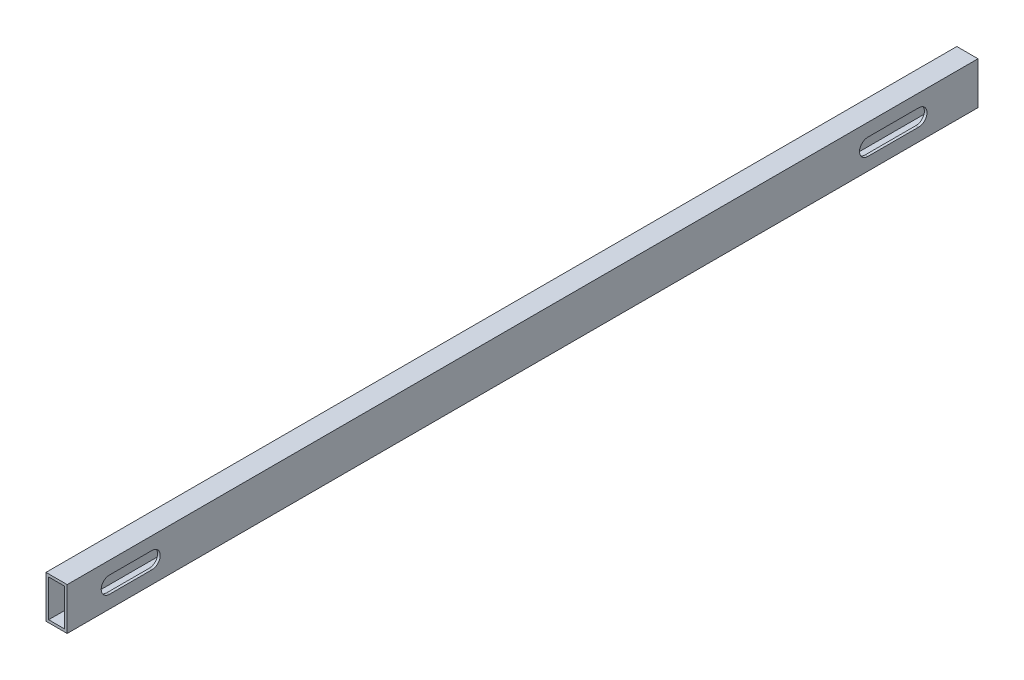
ISO-10303-21;
HEADER;
FILE_DESCRIPTION(('STEP AP214'),'2;1');
FILE_NAME('part.step','',(''),(''),'','','');
FILE_SCHEMA(('AUTOMOTIVE_DESIGN { 1 0 10303 214 1 1 1 1 }'));
ENDSEC;
DATA;
#1=APPLICATION_CONTEXT('core data for automotive mechanical design processes');
#2=APPLICATION_PROTOCOL_DEFINITION('international standard','automotive_design',2000,#1);
#3=PRODUCT_CONTEXT('',#1,'mechanical');
#4=PRODUCT('Part','Part','',(#3));
#5=PRODUCT_RELATED_PRODUCT_CATEGORY('part','',(#4));
#6=PRODUCT_DEFINITION_FORMATION('','',#4);
#7=PRODUCT_DEFINITION_CONTEXT('part definition',#1,'design');
#8=PRODUCT_DEFINITION('design','',#6,#7);
#9=PRODUCT_DEFINITION_SHAPE('','',#8);
#10=(LENGTH_UNIT() NAMED_UNIT(*) SI_UNIT(.MILLI.,.METRE.));
#11=(NAMED_UNIT(*) PLANE_ANGLE_UNIT() SI_UNIT($,.RADIAN.));
#12=(NAMED_UNIT(*) SI_UNIT($,.STERADIAN.) SOLID_ANGLE_UNIT());
#13=UNCERTAINTY_MEASURE_WITH_UNIT(LENGTH_MEASURE(1.E-05),#10,'distance_accuracy_value','');
#14=(GEOMETRIC_REPRESENTATION_CONTEXT(3) GLOBAL_UNCERTAINTY_ASSIGNED_CONTEXT((#13)) GLOBAL_UNIT_ASSIGNED_CONTEXT((#10,
#11,#12)) REPRESENTATION_CONTEXT('',''));
#15=CARTESIAN_POINT('',(0.,0.,0.));
#16=DIRECTION('',(0.,0.,1.));
#17=DIRECTION('',(1.,0.,0.));
#18=AXIS2_PLACEMENT_3D('',#15,#16,#17);
#19=CARTESIAN_POINT('',(6.35,-12.7,546.1));
#20=DIRECTION('',(-1.,0.,0.));
#21=DIRECTION('',(0.,0.,1.));
#22=AXIS2_PLACEMENT_3D('',#19,#20,#21);
#23=PLANE('',#22);
#24=DIRECTION('',(0.,0.,-1.));
#25=VECTOR('',#24,1.);
#26=CARTESIAN_POINT('',(6.35,5.,495.3));
#27=LINE('',#26,#25);
#28=CARTESIAN_POINT('',(6.35,5.,520.7));
#29=VERTEX_POINT('',#28);
#30=CARTESIAN_POINT('',(6.35,5.,495.3));
#31=VERTEX_POINT('',#30);
#32=EDGE_CURVE('E221',#29,#31,#27,.T.);
#33=ORIENTED_EDGE('',*,*,#32,.T.);
#34=CARTESIAN_POINT('',(6.35,0.,495.3));
#35=DIRECTION('',(-1.,0.,0.));
#36=DIRECTION('',(0.,0.,1.));
#37=AXIS2_PLACEMENT_3D('',#34,#35,#36);
#38=CIRCLE('',#37,5.);
#39=CARTESIAN_POINT('',(6.35,-5.,495.3));
#40=VERTEX_POINT('',#39);
#41=EDGE_CURVE('E214',#31,#40,#38,.T.);
#42=ORIENTED_EDGE('',*,*,#41,.T.);
#43=DIRECTION('',(0.,0.,1.));
#44=VECTOR('',#43,1.);
#45=CARTESIAN_POINT('',(6.35,-5.,495.3));
#46=LINE('',#45,#44);
#47=CARTESIAN_POINT('',(6.35,-5.,520.7));
#48=VERTEX_POINT('',#47);
#49=EDGE_CURVE('E57',#40,#48,#46,.T.);
#50=ORIENTED_EDGE('',*,*,#49,.T.);
#51=CARTESIAN_POINT('',(6.35,0.,520.7));
#52=DIRECTION('',(-1.,0.,0.));
#53=DIRECTION('',(0.,0.,1.));
#54=AXIS2_PLACEMENT_3D('',#51,#52,#53);
#55=CIRCLE('',#54,5.);
#56=EDGE_CURVE('E218',#48,#29,#55,.T.);
#57=ORIENTED_EDGE('',*,*,#56,.T.);
#58=EDGE_LOOP('',(#33,#42,#50,#57));
#59=FACE_BOUND('',#58,.T.);
#60=DIRECTION('',(0.,1.,0.));
#61=VECTOR('',#60,1.);
#62=CARTESIAN_POINT('',(6.35,-12.7,0.));
#63=LINE('',#62,#61);
#64=CARTESIAN_POINT('',(6.35,-12.7,0.));
#65=VERTEX_POINT('',#64);
#66=CARTESIAN_POINT('',(6.35,12.7,0.));
#67=VERTEX_POINT('',#66);
#68=EDGE_CURVE('E299',#65,#67,#63,.T.);
#69=ORIENTED_EDGE('',*,*,#68,.T.);
#70=DIRECTION('',(0.,0.,-1.));
#71=VECTOR('',#70,1.);
#72=CARTESIAN_POINT('',(6.35,12.7,546.1));
#73=LINE('',#72,#71);
#74=CARTESIAN_POINT('',(6.35,12.7,546.1));
#75=VERTEX_POINT('',#74);
#76=EDGE_CURVE('E326',#75,#67,#73,.T.);
#77=ORIENTED_EDGE('',*,*,#76,.F.);
#78=DIRECTION('',(0.,1.,0.));
#79=VECTOR('',#78,1.);
#80=CARTESIAN_POINT('',(6.35,-12.7,546.1));
#81=LINE('',#80,#79);
#82=CARTESIAN_POINT('',(6.35,-12.7,546.1));
#83=VERTEX_POINT('',#82);
#84=EDGE_CURVE('E300',#83,#75,#81,.T.);
#85=ORIENTED_EDGE('',*,*,#84,.F.);
#86=DIRECTION('',(0.,0.,-1.));
#87=VECTOR('',#86,1.);
#88=CARTESIAN_POINT('',(6.35,-12.7,546.1));
#89=LINE('',#88,#87);
#90=EDGE_CURVE('E310',#83,#65,#89,.T.);
#91=ORIENTED_EDGE('',*,*,#90,.T.);
#92=EDGE_LOOP('',(#69,#77,#85,#91));
#93=FACE_BOUND('',#92,.T.);
#94=DIRECTION('',(0.,0.,-1.));
#95=VECTOR('',#94,1.);
#96=CARTESIAN_POINT('',(6.35,5.,35.56));
#97=LINE('',#96,#95);
#98=CARTESIAN_POINT('',(6.35,5.,66.04));
#99=VERTEX_POINT('',#98);
#100=CARTESIAN_POINT('',(6.35,5.,35.56));
#101=VERTEX_POINT('',#100);
#102=EDGE_CURVE('E186',#99,#101,#97,.T.);
#103=ORIENTED_EDGE('',*,*,#102,.T.);
#104=CARTESIAN_POINT('',(6.35,0.,35.56));
#105=DIRECTION('',(-1.,0.,0.));
#106=DIRECTION('',(0.,0.,1.));
#107=AXIS2_PLACEMENT_3D('',#104,#105,#106);
#108=CIRCLE('',#107,5.);
#109=CARTESIAN_POINT('',(6.35,-5.,35.56));
#110=VERTEX_POINT('',#109);
#111=EDGE_CURVE('E190',#101,#110,#108,.T.);
#112=ORIENTED_EDGE('',*,*,#111,.T.);
#113=DIRECTION('',(0.,0.,1.));
#114=VECTOR('',#113,1.);
#115=CARTESIAN_POINT('',(6.35,-5.,35.56));
#116=LINE('',#115,#114);
#117=CARTESIAN_POINT('',(6.35,-5.,66.04));
#118=VERTEX_POINT('',#117);
#119=EDGE_CURVE('E49',#110,#118,#116,.T.);
#120=ORIENTED_EDGE('',*,*,#119,.T.);
#121=CARTESIAN_POINT('',(6.35,0.,66.04));
#122=DIRECTION('',(-1.,0.,0.));
#123=DIRECTION('',(0.,0.,1.));
#124=AXIS2_PLACEMENT_3D('',#121,#122,#123);
#125=CIRCLE('',#124,5.);
#126=EDGE_CURVE('E181',#118,#99,#125,.T.);
#127=ORIENTED_EDGE('',*,*,#126,.T.);
#128=EDGE_LOOP('',(#103,#112,#120,#127));
#129=FACE_BOUND('',#128,.T.);
#130=ADVANCED_FACE('F35',(#59,#93,#129),#23,.F.);
#131=CARTESIAN_POINT('',(4.7625,-11.1125,546.1));
#132=DIRECTION('',(-1.,0.,0.));
#133=DIRECTION('',(0.,0.,1.));
#134=AXIS2_PLACEMENT_3D('',#131,#132,#133);
#135=PLANE('',#134);
#136=CARTESIAN_POINT('',(4.7625,0.,495.3));
#137=DIRECTION('',(-1.,0.,0.));
#138=DIRECTION('',(0.,0.,1.));
#139=AXIS2_PLACEMENT_3D('',#136,#137,#138);
#140=CIRCLE('',#139,5.);
#141=CARTESIAN_POINT('',(4.7625,5.,495.3));
#142=VERTEX_POINT('',#141);
#143=CARTESIAN_POINT('',(4.7625,-5.,495.3));
#144=VERTEX_POINT('',#143);
#145=EDGE_CURVE('E211',#142,#144,#140,.T.);
#146=ORIENTED_EDGE('',*,*,#145,.F.);
#147=DIRECTION('',(0.,0.,-1.));
#148=VECTOR('',#147,1.);
#149=CARTESIAN_POINT('',(4.7625,5.,495.3));
#150=LINE('',#149,#148);
#151=CARTESIAN_POINT('',(4.7625,5.,520.7));
#152=VERTEX_POINT('',#151);
#153=EDGE_CURVE('E232',#152,#142,#150,.T.);
#154=ORIENTED_EDGE('',*,*,#153,.F.);
#155=CARTESIAN_POINT('',(4.7625,0.,520.7));
#156=DIRECTION('',(-1.,0.,0.));
#157=DIRECTION('',(0.,0.,1.));
#158=AXIS2_PLACEMENT_3D('',#155,#156,#157);
#159=CIRCLE('',#158,5.);
#160=CARTESIAN_POINT('',(4.7625,-5.,520.7));
#161=VERTEX_POINT('',#160);
#162=EDGE_CURVE('E204',#161,#152,#159,.T.);
#163=ORIENTED_EDGE('',*,*,#162,.F.);
#164=DIRECTION('',(0.,0.,1.));
#165=VECTOR('',#164,1.);
#166=CARTESIAN_POINT('',(4.7625,-5.,495.3));
#167=LINE('',#166,#165);
#168=EDGE_CURVE('E207',#144,#161,#167,.T.);
#169=ORIENTED_EDGE('',*,*,#168,.F.);
#170=EDGE_LOOP('',(#146,#154,#163,#169));
#171=FACE_BOUND('',#170,.T.);
#172=DIRECTION('',(0.,1.,0.));
#173=VECTOR('',#172,1.);
#174=CARTESIAN_POINT('',(4.7625,-11.1125,0.));
#175=LINE('',#174,#173);
#176=CARTESIAN_POINT('',(4.7625,-11.1125,0.));
#177=VERTEX_POINT('',#176);
#178=CARTESIAN_POINT('',(4.7625,11.1125,0.));
#179=VERTEX_POINT('',#178);
#180=EDGE_CURVE('E278',#177,#179,#175,.T.);
#181=ORIENTED_EDGE('',*,*,#180,.F.);
#182=DIRECTION('',(0.,0.,-1.));
#183=VECTOR('',#182,1.);
#184=CARTESIAN_POINT('',(4.7625,-11.1125,546.1));
#185=LINE('',#184,#183);
#186=CARTESIAN_POINT('',(4.7625,-11.1125,546.1));
#187=VERTEX_POINT('',#186);
#188=EDGE_CURVE('E277',#187,#177,#185,.T.);
#189=ORIENTED_EDGE('',*,*,#188,.F.);
#190=DIRECTION('',(0.,1.,0.));
#191=VECTOR('',#190,1.);
#192=CARTESIAN_POINT('',(4.7625,-11.1125,546.1));
#193=LINE('',#192,#191);
#194=CARTESIAN_POINT('',(4.7625,11.1125,546.1));
#195=VERTEX_POINT('',#194);
#196=EDGE_CURVE('E267',#187,#195,#193,.T.);
#197=ORIENTED_EDGE('',*,*,#196,.T.);
#198=DIRECTION('',(0.,0.,-1.));
#199=VECTOR('',#198,1.);
#200=CARTESIAN_POINT('',(4.7625,11.1125,546.1));
#201=LINE('',#200,#199);
#202=EDGE_CURVE('E296',#195,#179,#201,.T.);
#203=ORIENTED_EDGE('',*,*,#202,.T.);
#204=EDGE_LOOP('',(#181,#189,#197,#203));
#205=FACE_BOUND('',#204,.T.);
#206=CARTESIAN_POINT('',(4.7625,0.,35.56));
#207=DIRECTION('',(-1.,0.,0.));
#208=DIRECTION('',(0.,0.,1.));
#209=AXIS2_PLACEMENT_3D('',#206,#207,#208);
#210=CIRCLE('',#209,5.);
#211=CARTESIAN_POINT('',(4.7625,5.00000000000001,35.56));
#212=VERTEX_POINT('',#211);
#213=CARTESIAN_POINT('',(4.7625,-5.,35.56));
#214=VERTEX_POINT('',#213);
#215=EDGE_CURVE('E192',#212,#214,#210,.T.);
#216=ORIENTED_EDGE('',*,*,#215,.F.);
#217=DIRECTION('',(0.,0.,-1.));
#218=VECTOR('',#217,1.);
#219=CARTESIAN_POINT('',(4.7625,5.,35.56));
#220=LINE('',#219,#218);
#221=CARTESIAN_POINT('',(4.7625,5.,66.04));
#222=VERTEX_POINT('',#221);
#223=EDGE_CURVE('E201',#222,#212,#220,.T.);
#224=ORIENTED_EDGE('',*,*,#223,.F.);
#225=CARTESIAN_POINT('',(4.7625,0.,66.04));
#226=DIRECTION('',(-1.,0.,0.));
#227=DIRECTION('',(0.,0.,1.));
#228=AXIS2_PLACEMENT_3D('',#225,#226,#227);
#229=CIRCLE('',#228,5.);
#230=CARTESIAN_POINT('',(4.7625,-5.,66.04));
#231=VERTEX_POINT('',#230);
#232=EDGE_CURVE('E234',#231,#222,#229,.T.);
#233=ORIENTED_EDGE('',*,*,#232,.F.);
#234=DIRECTION('',(0.,0.,1.));
#235=VECTOR('',#234,1.);
#236=CARTESIAN_POINT('',(4.7625,-5.,35.56));
#237=LINE('',#236,#235);
#238=EDGE_CURVE('E173',#214,#231,#237,.T.);
#239=ORIENTED_EDGE('',*,*,#238,.F.);
#240=EDGE_LOOP('',(#216,#224,#233,#239));
#241=FACE_BOUND('',#240,.T.);
#242=ADVANCED_FACE('F396',(#171,#205,#241),#135,.T.);
#243=CARTESIAN_POINT('',(0.,0.,546.1));
#244=DIRECTION('',(0.,0.,-1.));
#245=DIRECTION('',(-1.,0.,0.));
#246=AXIS2_PLACEMENT_3D('',#243,#244,#245);
#247=PLANE('',#246);
#248=ORIENTED_EDGE('',*,*,#84,.T.);
#249=DIRECTION('',(-1.,0.,0.));
#250=VECTOR('',#249,1.);
#251=CARTESIAN_POINT('',(-6.35,12.7,546.1));
#252=LINE('',#251,#250);
#253=CARTESIAN_POINT('',(-6.35,12.7,546.1));
#254=VERTEX_POINT('',#253);
#255=EDGE_CURVE('E303',#75,#254,#252,.T.);
#256=ORIENTED_EDGE('',*,*,#255,.T.);
#257=DIRECTION('',(0.,-1.,0.));
#258=VECTOR('',#257,1.);
#259=CARTESIAN_POINT('',(-6.35,-12.7,546.1));
#260=LINE('',#259,#258);
#261=CARTESIAN_POINT('',(-6.35,-12.7,546.1));
#262=VERTEX_POINT('',#261);
#263=EDGE_CURVE('E306',#254,#262,#260,.T.);
#264=ORIENTED_EDGE('',*,*,#263,.T.);
#265=DIRECTION('',(1.,0.,0.));
#266=VECTOR('',#265,1.);
#267=CARTESIAN_POINT('',(-6.35,-12.7,546.1));
#268=LINE('',#267,#266);
#269=EDGE_CURVE('E308',#262,#83,#268,.T.);
#270=ORIENTED_EDGE('',*,*,#269,.T.);
#271=EDGE_LOOP('',(#248,#256,#264,#270));
#272=FACE_BOUND('',#271,.T.);
#273=ORIENTED_EDGE('',*,*,#196,.F.);
#274=DIRECTION('',(1.,0.,0.));
#275=VECTOR('',#274,1.);
#276=CARTESIAN_POINT('',(-4.7625,-11.1125,546.1));
#277=LINE('',#276,#275);
#278=CARTESIAN_POINT('',(-4.7625,-11.1125,546.1));
#279=VERTEX_POINT('',#278);
#280=EDGE_CURVE('E275',#279,#187,#277,.T.);
#281=ORIENTED_EDGE('',*,*,#280,.F.);
#282=DIRECTION('',(0.,-1.,0.));
#283=VECTOR('',#282,1.);
#284=CARTESIAN_POINT('',(-4.7625,-11.1125,546.1));
#285=LINE('',#284,#283);
#286=CARTESIAN_POINT('',(-4.7625,11.1125,546.1));
#287=VERTEX_POINT('',#286);
#288=EDGE_CURVE('E272',#287,#279,#285,.T.);
#289=ORIENTED_EDGE('',*,*,#288,.F.);
#290=DIRECTION('',(-1.,0.,0.));
#291=VECTOR('',#290,1.);
#292=CARTESIAN_POINT('',(-4.7625,11.1125,546.1));
#293=LINE('',#292,#291);
#294=EDGE_CURVE('E269',#195,#287,#293,.T.);
#295=ORIENTED_EDGE('',*,*,#294,.F.);
#296=EDGE_LOOP('',(#273,#281,#289,#295));
#297=FACE_BOUND('',#296,.T.);
#298=ADVANCED_FACE('F387',(#272,#297),#247,.F.);
#299=CARTESIAN_POINT('',(0.,0.,0.));
#300=DIRECTION('',(0.,0.,-1.));
#301=DIRECTION('',(-1.,0.,0.));
#302=AXIS2_PLACEMENT_3D('',#299,#300,#301);
#303=PLANE('',#302);
#304=ORIENTED_EDGE('',*,*,#68,.F.);
#305=DIRECTION('',(1.,0.,0.));
#306=VECTOR('',#305,1.);
#307=CARTESIAN_POINT('',(-6.35,-12.7,0.));
#308=LINE('',#307,#306);
#309=CARTESIAN_POINT('',(-6.35,-12.7,0.));
#310=VERTEX_POINT('',#309);
#311=EDGE_CURVE('E304',#310,#65,#308,.T.);
#312=ORIENTED_EDGE('',*,*,#311,.F.);
#313=DIRECTION('',(0.,-1.,0.));
#314=VECTOR('',#313,1.);
#315=CARTESIAN_POINT('',(-6.35,-12.7,0.));
#316=LINE('',#315,#314);
#317=CARTESIAN_POINT('',(-6.35,12.7,0.));
#318=VERTEX_POINT('',#317);
#319=EDGE_CURVE('E315',#318,#310,#316,.T.);
#320=ORIENTED_EDGE('',*,*,#319,.F.);
#321=DIRECTION('',(-1.,0.,0.));
#322=VECTOR('',#321,1.);
#323=CARTESIAN_POINT('',(-6.35,12.7,0.));
#324=LINE('',#323,#322);
#325=EDGE_CURVE('E313',#67,#318,#324,.T.);
#326=ORIENTED_EDGE('',*,*,#325,.F.);
#327=EDGE_LOOP('',(#304,#312,#320,#326));
#328=FACE_BOUND('',#327,.T.);
#329=DIRECTION('',(1.,0.,0.));
#330=VECTOR('',#329,1.);
#331=CARTESIAN_POINT('',(-4.7625,-11.1125,0.));
#332=LINE('',#331,#330);
#333=CARTESIAN_POINT('',(-4.7625,-11.1125,0.));
#334=VERTEX_POINT('',#333);
#335=EDGE_CURVE('E270',#334,#177,#332,.T.);
#336=ORIENTED_EDGE('',*,*,#335,.T.);
#337=ORIENTED_EDGE('',*,*,#180,.T.);
#338=DIRECTION('',(-1.,0.,0.));
#339=VECTOR('',#338,1.);
#340=CARTESIAN_POINT('',(-4.7625,11.1125,0.));
#341=LINE('',#340,#339);
#342=CARTESIAN_POINT('',(-4.7625,11.1125,0.));
#343=VERTEX_POINT('',#342);
#344=EDGE_CURVE('E281',#179,#343,#341,.T.);
#345=ORIENTED_EDGE('',*,*,#344,.T.);
#346=DIRECTION('',(0.,-1.,0.));
#347=VECTOR('',#346,1.);
#348=CARTESIAN_POINT('',(-4.7625,-11.1125,0.));
#349=LINE('',#348,#347);
#350=EDGE_CURVE('E285',#343,#334,#349,.T.);
#351=ORIENTED_EDGE('',*,*,#350,.T.);
#352=EDGE_LOOP('',(#336,#337,#345,#351));
#353=FACE_BOUND('',#352,.T.);
#354=ADVANCED_FACE('F381',(#328,#353),#303,.T.);
#355=CARTESIAN_POINT('',(-6.35,12.7,546.1));
#356=DIRECTION('',(0.,-1.,0.));
#357=DIRECTION('',(0.,0.,-1.));
#358=AXIS2_PLACEMENT_3D('',#355,#356,#357);
#359=PLANE('',#358);
#360=ORIENTED_EDGE('',*,*,#325,.T.);
#361=DIRECTION('',(0.,0.,-1.));
#362=VECTOR('',#361,1.);
#363=CARTESIAN_POINT('',(-6.35,12.7,546.1));
#364=LINE('',#363,#362);
#365=EDGE_CURVE('E323',#254,#318,#364,.T.);
#366=ORIENTED_EDGE('',*,*,#365,.F.);
#367=ORIENTED_EDGE('',*,*,#255,.F.);
#368=ORIENTED_EDGE('',*,*,#76,.T.);
#369=EDGE_LOOP('',(#360,#366,#367,#368));
#370=FACE_BOUND('',#369,.T.);
#371=ADVANCED_FACE('F363',(#370),#359,.F.);
#372=CARTESIAN_POINT('',(-6.35,-12.7,546.1));
#373=DIRECTION('',(1.,0.,0.));
#374=DIRECTION('',(0.,0.,-1.));
#375=AXIS2_PLACEMENT_3D('',#372,#373,#374);
#376=PLANE('',#375);
#377=DIRECTION('',(0.,0.,-1.));
#378=VECTOR('',#377,1.);
#379=CARTESIAN_POINT('',(-6.35,-3.30199999999994,44.45));
#380=LINE('',#379,#378);
#381=CARTESIAN_POINT('',(-6.35,-3.30199999999992,57.15));
#382=VERTEX_POINT('',#381);
#383=CARTESIAN_POINT('',(-6.35,-3.30199999999994,44.45));
#384=VERTEX_POINT('',#383);
#385=EDGE_CURVE('E247',#382,#384,#380,.T.);
#386=ORIENTED_EDGE('',*,*,#385,.T.);
#387=CARTESIAN_POINT('',(-6.35,0.,44.45));
#388=DIRECTION('',(1.,0.,0.));
#389=DIRECTION('',(0.,0.,-1.));
#390=AXIS2_PLACEMENT_3D('',#387,#388,#389);
#391=CIRCLE('',#390,3.302);
#392=CARTESIAN_POINT('',(-6.35,3.30200000000006,44.45));
#393=VERTEX_POINT('',#392);
#394=EDGE_CURVE('E238',#384,#393,#391,.T.);
#395=ORIENTED_EDGE('',*,*,#394,.T.);
#396=DIRECTION('',(0.,0.,1.));
#397=VECTOR('',#396,1.);
#398=CARTESIAN_POINT('',(-6.35,3.30200000000006,44.45));
#399=LINE('',#398,#397);
#400=CARTESIAN_POINT('',(-6.35,3.30200000000008,57.15));
#401=VERTEX_POINT('',#400);
#402=EDGE_CURVE('E241',#393,#401,#399,.T.);
#403=ORIENTED_EDGE('',*,*,#402,.T.);
#404=CARTESIAN_POINT('',(-6.35,0.,57.15));
#405=DIRECTION('',(1.,0.,0.));
#406=DIRECTION('',(0.,0.,-1.));
#407=AXIS2_PLACEMENT_3D('',#404,#405,#406);
#408=CIRCLE('',#407,3.302);
#409=EDGE_CURVE('E244',#401,#382,#408,.T.);
#410=ORIENTED_EDGE('',*,*,#409,.T.);
#411=EDGE_LOOP('',(#386,#395,#403,#410));
#412=FACE_BOUND('',#411,.T.);
#413=CARTESIAN_POINT('',(-6.35,0.,520.7));
#414=DIRECTION('',(1.,0.,0.));
#415=DIRECTION('',(0.,0.,-1.));
#416=AXIS2_PLACEMENT_3D('',#413,#414,#415);
#417=CIRCLE('',#416,2.75000000000004);
#418=CARTESIAN_POINT('',(-6.35,0.,517.95));
#419=VERTEX_POINT('',#418);
#420=EDGE_CURVE('E237',#419,#419,#417,.T.);
#421=ORIENTED_EDGE('',*,*,#420,.T.);
#422=EDGE_LOOP('',(#421));
#423=FACE_BOUND('',#422,.T.);
#424=CARTESIAN_POINT('',(-6.35,0.,495.3));
#425=DIRECTION('',(1.,0.,0.));
#426=DIRECTION('',(0.,0.,1.));
#427=AXIS2_PLACEMENT_3D('',#424,#425,#426);
#428=CIRCLE('',#427,2.75000000000004);
#429=CARTESIAN_POINT('',(-6.35,0.,498.05));
#430=VERTEX_POINT('',#429);
#431=EDGE_CURVE('E203',#430,#430,#428,.T.);
#432=ORIENTED_EDGE('',*,*,#431,.T.);
#433=EDGE_LOOP('',(#432));
#434=FACE_BOUND('',#433,.T.);
#435=CARTESIAN_POINT('',(-6.35,0.,508.));
#436=DIRECTION('',(1.,0.,0.));
#437=DIRECTION('',(0.,0.,-1.));
#438=AXIS2_PLACEMENT_3D('',#435,#436,#437);
#439=CIRCLE('',#438,3.80999999999999);
#440=CARTESIAN_POINT('',(-6.35,0.,504.19));
#441=VERTEX_POINT('',#440);
#442=EDGE_CURVE('E254',#441,#441,#439,.T.);
#443=ORIENTED_EDGE('',*,*,#442,.T.);
#444=EDGE_LOOP('',(#443));
#445=FACE_BOUND('',#444,.T.);
#446=ORIENTED_EDGE('',*,*,#319,.T.);
#447=DIRECTION('',(0.,0.,-1.));
#448=VECTOR('',#447,1.);
#449=CARTESIAN_POINT('',(-6.35,-12.7,546.1));
#450=LINE('',#449,#448);
#451=EDGE_CURVE('E320',#262,#310,#450,.T.);
#452=ORIENTED_EDGE('',*,*,#451,.F.);
#453=ORIENTED_EDGE('',*,*,#263,.F.);
#454=ORIENTED_EDGE('',*,*,#365,.T.);
#455=EDGE_LOOP('',(#446,#452,#453,#454));
#456=FACE_BOUND('',#455,.T.);
#457=ADVANCED_FACE('F359',(#412,#423,#434,#445,#456),#376,.F.);
#458=CARTESIAN_POINT('',(-6.35,-12.7,546.1));
#459=DIRECTION('',(0.,1.,0.));
#460=DIRECTION('',(0.,0.,1.));
#461=AXIS2_PLACEMENT_3D('',#458,#459,#460);
#462=PLANE('',#461);
#463=CARTESIAN_POINT('',(0.,-12.7,533.4));
#464=DIRECTION('',(0.,-1.,0.));
#465=DIRECTION('',(0.,0.,-1.));
#466=AXIS2_PLACEMENT_3D('',#463,#464,#465);
#467=CIRCLE('',#466,2.74999999999992);
#468=CARTESIAN_POINT('',(0.,-12.7,530.65));
#469=VERTEX_POINT('',#468);
#470=EDGE_CURVE('E208',#469,#469,#467,.T.);
#471=ORIENTED_EDGE('',*,*,#470,.F.);
#472=EDGE_LOOP('',(#471));
#473=FACE_BOUND('',#472,.T.);
#474=CARTESIAN_POINT('',(0.,-12.7,12.7000000000003));
#475=DIRECTION('',(0.,-1.,0.));
#476=DIRECTION('',(0.,0.,1.));
#477=AXIS2_PLACEMENT_3D('',#474,#475,#476);
#478=CIRCLE('',#477,2.74999999999992);
#479=CARTESIAN_POINT('',(0.,-12.7,9.95000000000034));
#480=VERTEX_POINT('',#479);
#481=EDGE_CURVE('E473',#480,#480,#478,.T.);
#482=ORIENTED_EDGE('',*,*,#481,.F.);
#483=EDGE_LOOP('',(#482));
#484=FACE_BOUND('',#483,.T.);
#485=ORIENTED_EDGE('',*,*,#311,.T.);
#486=ORIENTED_EDGE('',*,*,#90,.F.);
#487=ORIENTED_EDGE('',*,*,#269,.F.);
#488=ORIENTED_EDGE('',*,*,#451,.T.);
#489=EDGE_LOOP('',(#485,#486,#487,#488));
#490=FACE_BOUND('',#489,.T.);
#491=ADVANCED_FACE('F362',(#473,#484,#490),#462,.F.);
#492=CARTESIAN_POINT('',(-4.7625,11.1125,546.1));
#493=DIRECTION('',(0.,-1.,0.));
#494=DIRECTION('',(0.,0.,-1.));
#495=AXIS2_PLACEMENT_3D('',#492,#493,#494);
#496=PLANE('',#495);
#497=ORIENTED_EDGE('',*,*,#344,.F.);
#498=ORIENTED_EDGE('',*,*,#202,.F.);
#499=ORIENTED_EDGE('',*,*,#294,.T.);
#500=DIRECTION('',(0.,0.,-1.));
#501=VECTOR('',#500,1.);
#502=CARTESIAN_POINT('',(-4.7625,11.1125,546.1));
#503=LINE('',#502,#501);
#504=EDGE_CURVE('E294',#287,#343,#503,.T.);
#505=ORIENTED_EDGE('',*,*,#504,.T.);
#506=EDGE_LOOP('',(#497,#498,#499,#505));
#507=FACE_BOUND('',#506,.T.);
#508=ADVANCED_FACE('F458',(#507),#496,.T.);
#509=CARTESIAN_POINT('',(-4.7625,-11.1125,546.1));
#510=DIRECTION('',(1.,0.,0.));
#511=DIRECTION('',(0.,0.,-1.));
#512=AXIS2_PLACEMENT_3D('',#509,#510,#511);
#513=PLANE('',#512);
#514=CARTESIAN_POINT('',(-4.7625,0.,44.45));
#515=DIRECTION('',(1.,0.,0.));
#516=DIRECTION('',(0.,0.,-1.));
#517=AXIS2_PLACEMENT_3D('',#514,#515,#516);
#518=CIRCLE('',#517,3.302);
#519=CARTESIAN_POINT('',(-4.7625,-3.30199999999994,44.45));
#520=VERTEX_POINT('',#519);
#521=CARTESIAN_POINT('',(-4.7625,3.30200000000006,44.45));
#522=VERTEX_POINT('',#521);
#523=EDGE_CURVE('E11',#520,#522,#518,.T.);
#524=ORIENTED_EDGE('',*,*,#523,.F.);
#525=DIRECTION('',(0.,0.,-1.));
#526=VECTOR('',#525,1.);
#527=CARTESIAN_POINT('',(-4.7625,-3.30199999999924,546.1));
#528=LINE('',#527,#526);
#529=CARTESIAN_POINT('',(-4.7625,-3.30199999999992,57.15));
#530=VERTEX_POINT('',#529);
#531=EDGE_CURVE('E42',#530,#520,#528,.T.);
#532=ORIENTED_EDGE('',*,*,#531,.F.);
#533=CARTESIAN_POINT('',(-4.7625,0.,57.15));
#534=DIRECTION('',(1.,0.,0.));
#535=DIRECTION('',(0.,0.,-1.));
#536=AXIS2_PLACEMENT_3D('',#533,#534,#535);
#537=CIRCLE('',#536,3.302);
#538=CARTESIAN_POINT('',(-4.7625,3.30200000000008,57.15));
#539=VERTEX_POINT('',#538);
#540=EDGE_CURVE('E338',#539,#530,#537,.T.);
#541=ORIENTED_EDGE('',*,*,#540,.F.);
#542=DIRECTION('',(0.,0.,1.));
#543=VECTOR('',#542,1.);
#544=CARTESIAN_POINT('',(-4.7625,3.30200000000076,546.1));
#545=LINE('',#544,#543);
#546=EDGE_CURVE('E329',#522,#539,#545,.T.);
#547=ORIENTED_EDGE('',*,*,#546,.F.);
#548=EDGE_LOOP('',(#524,#532,#541,#547));
#549=FACE_BOUND('',#548,.T.);
#550=CARTESIAN_POINT('',(-4.7625,0.,520.7));
#551=DIRECTION('',(1.,0.,0.));
#552=DIRECTION('',(0.,0.,-1.));
#553=AXIS2_PLACEMENT_3D('',#550,#551,#552);
#554=CIRCLE('',#553,2.75000000000004);
#555=CARTESIAN_POINT('',(-4.7625,0.,517.95));
#556=VERTEX_POINT('',#555);
#557=EDGE_CURVE('E282',#556,#556,#554,.T.);
#558=ORIENTED_EDGE('',*,*,#557,.F.);
#559=EDGE_LOOP('',(#558));
#560=FACE_BOUND('',#559,.T.);
#561=CARTESIAN_POINT('',(-4.7625,0.,495.3));
#562=DIRECTION('',(1.,0.,0.));
#563=DIRECTION('',(0.,0.,-1.));
#564=AXIS2_PLACEMENT_3D('',#561,#562,#563);
#565=CIRCLE('',#564,2.75000000000004);
#566=CARTESIAN_POINT('',(-4.7625,0.,492.55));
#567=VERTEX_POINT('',#566);
#568=EDGE_CURVE('E332',#567,#567,#565,.T.);
#569=ORIENTED_EDGE('',*,*,#568,.F.);
#570=EDGE_LOOP('',(#569));
#571=FACE_BOUND('',#570,.T.);
#572=CARTESIAN_POINT('',(-4.7625,0.,508.));
#573=DIRECTION('',(1.,0.,0.));
#574=DIRECTION('',(0.,0.,-1.));
#575=AXIS2_PLACEMENT_3D('',#572,#573,#574);
#576=CIRCLE('',#575,3.80999999999999);
#577=CARTESIAN_POINT('',(-4.7625,0.,504.19));
#578=VERTEX_POINT('',#577);
#579=EDGE_CURVE('E266',#578,#578,#576,.T.);
#580=ORIENTED_EDGE('',*,*,#579,.F.);
#581=EDGE_LOOP('',(#580));
#582=FACE_BOUND('',#581,.T.);
#583=ORIENTED_EDGE('',*,*,#350,.F.);
#584=ORIENTED_EDGE('',*,*,#504,.F.);
#585=ORIENTED_EDGE('',*,*,#288,.T.);
#586=DIRECTION('',(0.,0.,-1.));
#587=VECTOR('',#586,1.);
#588=CARTESIAN_POINT('',(-4.7625,-11.1125,546.1));
#589=LINE('',#588,#587);
#590=EDGE_CURVE('E292',#279,#334,#589,.T.);
#591=ORIENTED_EDGE('',*,*,#590,.T.);
#592=EDGE_LOOP('',(#583,#584,#585,#591));
#593=FACE_BOUND('',#592,.T.);
#594=ADVANCED_FACE('F350',(#549,#560,#571,#582,#593),#513,.T.);
#595=CARTESIAN_POINT('',(-4.7625,-11.1125,546.1));
#596=DIRECTION('',(0.,1.,0.));
#597=DIRECTION('',(0.,0.,1.));
#598=AXIS2_PLACEMENT_3D('',#595,#596,#597);
#599=PLANE('',#598);
#600=CARTESIAN_POINT('',(0.,-11.1125,533.4));
#601=DIRECTION('',(0.,1.,0.));
#602=DIRECTION('',(0.,0.,1.));
#603=AXIS2_PLACEMENT_3D('',#600,#601,#602);
#604=CIRCLE('',#603,2.74999999999992);
#605=CARTESIAN_POINT('',(0.,-11.1125,530.65));
#606=VERTEX_POINT('',#605);
#607=EDGE_CURVE('E475',#606,#606,#604,.F.);
#608=ORIENTED_EDGE('',*,*,#607,.T.);
#609=EDGE_LOOP('',(#608));
#610=FACE_BOUND('',#609,.T.);
#611=CARTESIAN_POINT('',(0.,-11.1125,12.7000000000003));
#612=DIRECTION('',(0.,1.,0.));
#613=DIRECTION('',(0.,0.,1.));
#614=AXIS2_PLACEMENT_3D('',#611,#612,#613);
#615=CIRCLE('',#614,2.74999999999992);
#616=CARTESIAN_POINT('',(0.,-11.1125,9.95000000000034));
#617=VERTEX_POINT('',#616);
#618=EDGE_CURVE('E476',#617,#617,#615,.F.);
#619=ORIENTED_EDGE('',*,*,#618,.T.);
#620=EDGE_LOOP('',(#619));
#621=FACE_BOUND('',#620,.T.);
#622=ORIENTED_EDGE('',*,*,#335,.F.);
#623=ORIENTED_EDGE('',*,*,#590,.F.);
#624=ORIENTED_EDGE('',*,*,#280,.T.);
#625=ORIENTED_EDGE('',*,*,#188,.T.);
#626=EDGE_LOOP('',(#622,#623,#624,#625));
#627=FACE_BOUND('',#626,.T.);
#628=ADVANCED_FACE('F451',(#610,#621,#627),#599,.T.);
#629=CARTESIAN_POINT('',(-6.35,0.,508.));
#630=DIRECTION('',(1.,0.,0.));
#631=DIRECTION('',(0.,0.,-1.));
#632=AXIS2_PLACEMENT_3D('',#629,#630,#631);
#633=CYLINDRICAL_SURFACE('',#632,3.80999999999999);
#634=ORIENTED_EDGE('',*,*,#579,.T.);
#635=EDGE_LOOP('',(#634));
#636=FACE_BOUND('',#635,.T.);
#637=ORIENTED_EDGE('',*,*,#442,.F.);
#638=EDGE_LOOP('',(#637));
#639=FACE_BOUND('',#638,.T.);
#640=ADVANCED_FACE('F436',(#636,#639),#633,.F.);
#641=CARTESIAN_POINT('',(-6.35,0.,495.3));
#642=DIRECTION('',(1.,0.,0.));
#643=DIRECTION('',(0.,0.,-1.));
#644=AXIS2_PLACEMENT_3D('',#641,#642,#643);
#645=CYLINDRICAL_SURFACE('',#644,2.75000000000004);
#646=ORIENTED_EDGE('',*,*,#568,.T.);
#647=EDGE_LOOP('',(#646));
#648=FACE_BOUND('',#647,.T.);
#649=ORIENTED_EDGE('',*,*,#431,.F.);
#650=EDGE_LOOP('',(#649));
#651=FACE_BOUND('',#650,.T.);
#652=ADVANCED_FACE('F432',(#648,#651),#645,.F.);
#653=CARTESIAN_POINT('',(-6.35,0.,520.7));
#654=DIRECTION('',(1.,0.,0.));
#655=DIRECTION('',(0.,0.,-1.));
#656=AXIS2_PLACEMENT_3D('',#653,#654,#655);
#657=CYLINDRICAL_SURFACE('',#656,2.75000000000004);
#658=ORIENTED_EDGE('',*,*,#557,.T.);
#659=EDGE_LOOP('',(#658));
#660=FACE_BOUND('',#659,.T.);
#661=ORIENTED_EDGE('',*,*,#420,.F.);
#662=EDGE_LOOP('',(#661));
#663=FACE_BOUND('',#662,.T.);
#664=ADVANCED_FACE('F435',(#660,#663),#657,.F.);
#665=CARTESIAN_POINT('',(-6.35,3.30200000000006,44.45));
#666=DIRECTION('',(0.,1.,0.));
#667=DIRECTION('',(0.,0.,1.));
#668=AXIS2_PLACEMENT_3D('',#665,#666,#667);
#669=PLANE('',#668);
#670=ORIENTED_EDGE('',*,*,#546,.T.);
#671=DIRECTION('',(1.,0.,0.));
#672=VECTOR('',#671,1.);
#673=CARTESIAN_POINT('',(-6.35,3.30200000000008,57.15));
#674=LINE('',#673,#672);
#675=EDGE_CURVE('E258',#401,#539,#674,.T.);
#676=ORIENTED_EDGE('',*,*,#675,.F.);
#677=ORIENTED_EDGE('',*,*,#402,.F.);
#678=DIRECTION('',(1.,0.,0.));
#679=VECTOR('',#678,1.);
#680=CARTESIAN_POINT('',(-6.35,3.30200000000006,44.45));
#681=LINE('',#680,#679);
#682=EDGE_CURVE('E250',#393,#522,#681,.T.);
#683=ORIENTED_EDGE('',*,*,#682,.T.);
#684=EDGE_LOOP('',(#670,#676,#677,#683));
#685=FACE_BOUND('',#684,.T.);
#686=ADVANCED_FACE('F354',(#685),#669,.F.);
#687=CARTESIAN_POINT('',(-6.35,0.,57.15));
#688=DIRECTION('',(1.,0.,0.));
#689=DIRECTION('',(0.,0.,-1.));
#690=AXIS2_PLACEMENT_3D('',#687,#688,#689);
#691=CYLINDRICAL_SURFACE('',#690,3.302);
#692=ORIENTED_EDGE('',*,*,#540,.T.);
#693=DIRECTION('',(1.,0.,0.));
#694=VECTOR('',#693,1.);
#695=CARTESIAN_POINT('',(-6.35,-3.30199999999992,57.15));
#696=LINE('',#695,#694);
#697=EDGE_CURVE('E255',#382,#530,#696,.T.);
#698=ORIENTED_EDGE('',*,*,#697,.F.);
#699=ORIENTED_EDGE('',*,*,#409,.F.);
#700=ORIENTED_EDGE('',*,*,#675,.T.);
#701=EDGE_LOOP('',(#692,#698,#699,#700));
#702=FACE_BOUND('',#701,.T.);
#703=ADVANCED_FACE('F357',(#702),#691,.F.);
#704=CARTESIAN_POINT('',(-6.35,-3.30199999999994,44.45));
#705=DIRECTION('',(0.,-1.,0.));
#706=DIRECTION('',(0.,0.,-1.));
#707=AXIS2_PLACEMENT_3D('',#704,#705,#706);
#708=PLANE('',#707);
#709=ORIENTED_EDGE('',*,*,#531,.T.);
#710=DIRECTION('',(1.,0.,0.));
#711=VECTOR('',#710,1.);
#712=CARTESIAN_POINT('',(-6.35,-3.30199999999994,44.45));
#713=LINE('',#712,#711);
#714=EDGE_CURVE('E251',#384,#520,#713,.T.);
#715=ORIENTED_EDGE('',*,*,#714,.F.);
#716=ORIENTED_EDGE('',*,*,#385,.F.);
#717=ORIENTED_EDGE('',*,*,#697,.T.);
#718=EDGE_LOOP('',(#709,#715,#716,#717));
#719=FACE_BOUND('',#718,.T.);
#720=ADVANCED_FACE('F341',(#719),#708,.F.);
#721=CARTESIAN_POINT('',(-6.35,0.,44.45));
#722=DIRECTION('',(1.,0.,0.));
#723=DIRECTION('',(0.,0.,-1.));
#724=AXIS2_PLACEMENT_3D('',#721,#722,#723);
#725=CYLINDRICAL_SURFACE('',#724,3.302);
#726=ORIENTED_EDGE('',*,*,#523,.T.);
#727=ORIENTED_EDGE('',*,*,#682,.F.);
#728=ORIENTED_EDGE('',*,*,#394,.F.);
#729=ORIENTED_EDGE('',*,*,#714,.T.);
#730=EDGE_LOOP('',(#726,#727,#728,#729));
#731=FACE_BOUND('',#730,.T.);
#732=ADVANCED_FACE('F348',(#731),#725,.F.);
#733=CARTESIAN_POINT('',(-6.351,5.,495.3));
#734=DIRECTION('',(0.,-1.,0.));
#735=DIRECTION('',(0.,0.,-1.));
#736=AXIS2_PLACEMENT_3D('',#733,#734,#735);
#737=PLANE('',#736);
#738=ORIENTED_EDGE('',*,*,#153,.T.);
#739=DIRECTION('',(1.,0.,0.));
#740=VECTOR('',#739,1.);
#741=CARTESIAN_POINT('',(-6.351,5.,495.3));
#742=LINE('',#741,#740);
#743=EDGE_CURVE('E224',#142,#31,#742,.T.);
#744=ORIENTED_EDGE('',*,*,#743,.T.);
#745=ORIENTED_EDGE('',*,*,#32,.F.);
#746=DIRECTION('',(1.,0.,0.));
#747=VECTOR('',#746,1.);
#748=CARTESIAN_POINT('',(-6.351,5.,520.7));
#749=LINE('',#748,#747);
#750=EDGE_CURVE('E226',#152,#29,#749,.T.);
#751=ORIENTED_EDGE('',*,*,#750,.F.);
#752=EDGE_LOOP('',(#738,#744,#745,#751));
#753=FACE_BOUND('',#752,.T.);
#754=ADVANCED_FACE('F407',(#753),#737,.T.);
#755=CARTESIAN_POINT('',(-6.351,0.,520.7));
#756=DIRECTION('',(1.,0.,0.));
#757=DIRECTION('',(0.,0.,-1.));
#758=AXIS2_PLACEMENT_3D('',#755,#756,#757);
#759=CYLINDRICAL_SURFACE('',#758,5.);
#760=ORIENTED_EDGE('',*,*,#162,.T.);
#761=ORIENTED_EDGE('',*,*,#750,.T.);
#762=ORIENTED_EDGE('',*,*,#56,.F.);
#763=DIRECTION('',(1.,0.,0.));
#764=VECTOR('',#763,1.);
#765=CARTESIAN_POINT('',(-6.351,-5.,520.7));
#766=LINE('',#765,#764);
#767=EDGE_CURVE('E228',#161,#48,#766,.T.);
#768=ORIENTED_EDGE('',*,*,#767,.F.);
#769=EDGE_LOOP('',(#760,#761,#762,#768));
#770=FACE_BOUND('',#769,.T.);
#771=ADVANCED_FACE('F418',(#770),#759,.F.);
#772=CARTESIAN_POINT('',(-6.351,-5.,495.3));
#773=DIRECTION('',(0.,1.,0.));
#774=DIRECTION('',(0.,0.,1.));
#775=AXIS2_PLACEMENT_3D('',#772,#773,#774);
#776=PLANE('',#775);
#777=ORIENTED_EDGE('',*,*,#168,.T.);
#778=ORIENTED_EDGE('',*,*,#767,.T.);
#779=ORIENTED_EDGE('',*,*,#49,.F.);
#780=DIRECTION('',(1.,0.,0.));
#781=VECTOR('',#780,1.);
#782=CARTESIAN_POINT('',(-6.351,-5.,495.3));
#783=LINE('',#782,#781);
#784=EDGE_CURVE('E230',#144,#40,#783,.T.);
#785=ORIENTED_EDGE('',*,*,#784,.F.);
#786=EDGE_LOOP('',(#777,#778,#779,#785));
#787=FACE_BOUND('',#786,.T.);
#788=ADVANCED_FACE('F414',(#787),#776,.T.);
#789=CARTESIAN_POINT('',(-6.351,0.,495.3));
#790=DIRECTION('',(1.,0.,0.));
#791=DIRECTION('',(0.,0.,-1.));
#792=AXIS2_PLACEMENT_3D('',#789,#790,#791);
#793=CYLINDRICAL_SURFACE('',#792,5.);
#794=ORIENTED_EDGE('',*,*,#145,.T.);
#795=ORIENTED_EDGE('',*,*,#784,.T.);
#796=ORIENTED_EDGE('',*,*,#41,.F.);
#797=ORIENTED_EDGE('',*,*,#743,.F.);
#798=EDGE_LOOP('',(#794,#795,#796,#797));
#799=FACE_BOUND('',#798,.T.);
#800=ADVANCED_FACE('F412',(#799),#793,.F.);
#801=CARTESIAN_POINT('',(-6.351,5.,35.56));
#802=DIRECTION('',(0.,-1.,0.));
#803=DIRECTION('',(0.,0.,-1.));
#804=AXIS2_PLACEMENT_3D('',#801,#802,#803);
#805=PLANE('',#804);
#806=ORIENTED_EDGE('',*,*,#223,.T.);
#807=DIRECTION('',(1.,0.,0.));
#808=VECTOR('',#807,1.);
#809=CARTESIAN_POINT('',(-6.351,5.,35.56));
#810=LINE('',#809,#808);
#811=EDGE_CURVE('E197',#212,#101,#810,.T.);
#812=ORIENTED_EDGE('',*,*,#811,.T.);
#813=ORIENTED_EDGE('',*,*,#102,.F.);
#814=DIRECTION('',(1.,0.,0.));
#815=VECTOR('',#814,1.);
#816=CARTESIAN_POINT('',(-6.351,5.,66.04));
#817=LINE('',#816,#815);
#818=EDGE_CURVE('E178',#222,#99,#817,.T.);
#819=ORIENTED_EDGE('',*,*,#818,.F.);
#820=EDGE_LOOP('',(#806,#812,#813,#819));
#821=FACE_BOUND('',#820,.T.);
#822=ADVANCED_FACE('F431',(#821),#805,.T.);
#823=CARTESIAN_POINT('',(-6.351,0.,66.04));
#824=DIRECTION('',(1.,0.,0.));
#825=DIRECTION('',(0.,0.,-1.));
#826=AXIS2_PLACEMENT_3D('',#823,#824,#825);
#827=CYLINDRICAL_SURFACE('',#826,5.);
#828=ORIENTED_EDGE('',*,*,#232,.T.);
#829=ORIENTED_EDGE('',*,*,#818,.T.);
#830=ORIENTED_EDGE('',*,*,#126,.F.);
#831=DIRECTION('',(1.,0.,0.));
#832=VECTOR('',#831,1.);
#833=CARTESIAN_POINT('',(-6.351,-5.,66.04));
#834=LINE('',#833,#832);
#835=EDGE_CURVE('E169',#231,#118,#834,.T.);
#836=ORIENTED_EDGE('',*,*,#835,.F.);
#837=EDGE_LOOP('',(#828,#829,#830,#836));
#838=FACE_BOUND('',#837,.T.);
#839=ADVANCED_FACE('F182',(#838),#827,.F.);
#840=CARTESIAN_POINT('',(-6.351,-5.,35.56));
#841=DIRECTION('',(0.,1.,0.));
#842=DIRECTION('',(0.,0.,1.));
#843=AXIS2_PLACEMENT_3D('',#840,#841,#842);
#844=PLANE('',#843);
#845=ORIENTED_EDGE('',*,*,#238,.T.);
#846=ORIENTED_EDGE('',*,*,#835,.T.);
#847=ORIENTED_EDGE('',*,*,#119,.F.);
#848=DIRECTION('',(1.,0.,0.));
#849=VECTOR('',#848,1.);
#850=CARTESIAN_POINT('',(-6.351,-5.,35.56));
#851=LINE('',#850,#849);
#852=EDGE_CURVE('E177',#214,#110,#851,.T.);
#853=ORIENTED_EDGE('',*,*,#852,.F.);
#854=EDGE_LOOP('',(#845,#846,#847,#853));
#855=FACE_BOUND('',#854,.T.);
#856=ADVANCED_FACE('F171',(#855),#844,.T.);
#857=CARTESIAN_POINT('',(-6.351,0.,35.56));
#858=DIRECTION('',(1.,0.,0.));
#859=DIRECTION('',(0.,0.,-1.));
#860=AXIS2_PLACEMENT_3D('',#857,#858,#859);
#861=CYLINDRICAL_SURFACE('',#860,5.);
#862=ORIENTED_EDGE('',*,*,#215,.T.);
#863=ORIENTED_EDGE('',*,*,#852,.T.);
#864=ORIENTED_EDGE('',*,*,#111,.F.);
#865=ORIENTED_EDGE('',*,*,#811,.F.);
#866=EDGE_LOOP('',(#862,#863,#864,#865));
#867=FACE_BOUND('',#866,.T.);
#868=ADVANCED_FACE('F489',(#867),#861,.F.);
#869=CARTESIAN_POINT('',(0.,12.701,12.7000000000003));
#870=DIRECTION('',(0.,-1.,0.));
#871=DIRECTION('',(0.,0.,-1.));
#872=AXIS2_PLACEMENT_3D('',#869,#870,#871);
#873=CYLINDRICAL_SURFACE('',#872,2.74999999999992);
#874=CARTESIAN_POINT('',(0.,-11.1125,9.95000000000034));
#875=CARTESIAN_POINT('',(0.,-11.1290364583333,9.95000000000034));
#876=CARTESIAN_POINT('',(0.,-11.1455729166667,9.95000000000034));
#877=CARTESIAN_POINT('',(0.,-11.1786458333333,9.95000000000034));
#878=CARTESIAN_POINT('',(0.,-11.1951822916667,9.95000000000034));
#879=CARTESIAN_POINT('',(0.,-11.2282552083333,9.95000000000034));
#880=CARTESIAN_POINT('',(0.,-11.2447916666667,9.95000000000034));
#881=CARTESIAN_POINT('',(0.,-11.2778645833333,9.95000000000034));
#882=CARTESIAN_POINT('',(0.,-11.2944010416667,9.95000000000034));
#883=CARTESIAN_POINT('',(0.,-11.3274739583333,9.95000000000034));
#884=CARTESIAN_POINT('',(0.,-11.3440104166667,9.95000000000034));
#885=CARTESIAN_POINT('',(0.,-11.3770833333333,9.95000000000034));
#886=CARTESIAN_POINT('',(0.,-11.3936197916667,9.95000000000034));
#887=CARTESIAN_POINT('',(0.,-11.4266927083333,9.95000000000034));
#888=CARTESIAN_POINT('',(0.,-11.4432291666667,9.95000000000034));
#889=CARTESIAN_POINT('',(0.,-11.4763020833333,9.95000000000034));
#890=CARTESIAN_POINT('',(0.,-11.4928385416667,9.95000000000034));
#891=CARTESIAN_POINT('',(0.,-11.5259114583333,9.95000000000034));
#892=CARTESIAN_POINT('',(0.,-11.5424479166667,9.95000000000034));
#893=CARTESIAN_POINT('',(0.,-11.5755208333333,9.95000000000034));
#894=CARTESIAN_POINT('',(0.,-11.5920572916667,9.95000000000034));
#895=CARTESIAN_POINT('',(0.,-11.6251302083333,9.95000000000034));
#896=CARTESIAN_POINT('',(0.,-11.6416666666667,9.95000000000034));
#897=CARTESIAN_POINT('',(0.,-11.6747395833333,9.95000000000034));
#898=CARTESIAN_POINT('',(0.,-11.6912760416667,9.95000000000034));
#899=CARTESIAN_POINT('',(0.,-11.7243489583333,9.95000000000034));
#900=CARTESIAN_POINT('',(0.,-11.7408854166667,9.95000000000034));
#901=CARTESIAN_POINT('',(0.,-11.7739583333333,9.95000000000034));
#902=CARTESIAN_POINT('',(0.,-11.7904947916667,9.95000000000034));
#903=CARTESIAN_POINT('',(0.,-11.8235677083333,9.95000000000034));
#904=CARTESIAN_POINT('',(0.,-11.8401041666667,9.95000000000034));
#905=CARTESIAN_POINT('',(0.,-11.8731770833333,9.95000000000034));
#906=CARTESIAN_POINT('',(0.,-11.8897135416667,9.95000000000034));
#907=CARTESIAN_POINT('',(0.,-11.9227864583333,9.95000000000034));
#908=CARTESIAN_POINT('',(0.,-11.9393229166667,9.95000000000034));
#909=CARTESIAN_POINT('',(0.,-11.9723958333333,9.95000000000034));
#910=CARTESIAN_POINT('',(0.,-11.9889322916667,9.95000000000034));
#911=CARTESIAN_POINT('',(0.,-12.0220052083333,9.95000000000034));
#912=CARTESIAN_POINT('',(0.,-12.0385416666667,9.95000000000034));
#913=CARTESIAN_POINT('',(0.,-12.0716145833333,9.95000000000034));
#914=CARTESIAN_POINT('',(0.,-12.0881510416667,9.95000000000034));
#915=CARTESIAN_POINT('',(0.,-12.1212239583333,9.95000000000034));
#916=CARTESIAN_POINT('',(0.,-12.1377604166667,9.95000000000034));
#917=CARTESIAN_POINT('',(0.,-12.1708333333333,9.95000000000034));
#918=CARTESIAN_POINT('',(0.,-12.1873697916667,9.95000000000034));
#919=CARTESIAN_POINT('',(0.,-12.2204427083333,9.95000000000034));
#920=CARTESIAN_POINT('',(0.,-12.2369791666667,9.95000000000034));
#921=CARTESIAN_POINT('',(0.,-12.2700520833333,9.95000000000034));
#922=CARTESIAN_POINT('',(0.,-12.2865885416667,9.95000000000034));
#923=CARTESIAN_POINT('',(0.,-12.3196614583333,9.95000000000034));
#924=CARTESIAN_POINT('',(0.,-12.3361979166667,9.95000000000034));
#925=CARTESIAN_POINT('',(0.,-12.3692708333333,9.95000000000034));
#926=CARTESIAN_POINT('',(0.,-12.3858072916667,9.95000000000034));
#927=CARTESIAN_POINT('',(0.,-12.4188802083333,9.95000000000034));
#928=CARTESIAN_POINT('',(0.,-12.4354166666667,9.95000000000034));
#929=CARTESIAN_POINT('',(0.,-12.4684895833333,9.95000000000034));
#930=CARTESIAN_POINT('',(0.,-12.4850260416667,9.95000000000034));
#931=CARTESIAN_POINT('',(0.,-12.5180989583333,9.95000000000034));
#932=CARTESIAN_POINT('',(0.,-12.5346354166667,9.95000000000034));
#933=CARTESIAN_POINT('',(0.,-12.5677083333333,9.95000000000034));
#934=CARTESIAN_POINT('',(0.,-12.5842447916667,9.95000000000034));
#935=CARTESIAN_POINT('',(0.,-12.6173177083333,9.95000000000034));
#936=CARTESIAN_POINT('',(0.,-12.6338541666667,9.95000000000034));
#937=CARTESIAN_POINT('',(0.,-12.6669270833333,9.95000000000034));
#938=CARTESIAN_POINT('',(0.,-12.6834635416667,9.95000000000034));
#939=CARTESIAN_POINT('',(0.,-12.7,9.95000000000034));
#940=B_SPLINE_CURVE_WITH_KNOTS('',3,(#874,#875,#876,#877,#878,#879,#880,#881,#882,#883,#884,
#885,#886,#887,#888,#889,#890,#891,#892,#893,#894,#895,#896,#897,#898,#899,#900,#901,#902,#903,
#904,#905,#906,#907,#908,#909,#910,#911,#912,#913,#914,#915,#916,#917,#918,#919,#920,#921,#922,
#923,#924,#925,#926,#927,#928,#929,#930,#931,#932,#933,#934,#935,#936,#937,#938,#939),
.UNSPECIFIED.,.F.,.F.,(4,2,2,2,2,2,2,2,2,2,2,2,2,2,2,2,2,2,2,2,2,2,2,2,2,2,2,2,2,2,2,2,4),(0.,
0.0496093749999989,0.0992187499999977,0.148828125,0.198437499999999,0.248046874999998,
0.29765625,0.347265624999999,0.396874999999998,0.446484374999997,0.496093749999996,
0.545703124999998,0.595312499999997,0.644921874999996,0.694531249999998,0.744140624999997,
0.793749999999996,0.843359374999995,0.892968749999994,0.942578124999996,0.992187499999995,
1.04179687499999,1.09140625,1.14101562499999,1.19062499999999,1.24023437499999,1.28984374999999,
1.33945312499999,1.38906249999999,1.43867187499999,1.48828124999999,1.53789062499999,
1.58749999999999),.UNSPECIFIED.);
#941=EDGE_CURVE('BSEAM500',#617,#480,#940,.T.);
#942=ORIENTED_EDGE('',*,*,#618,.F.);
#943=ORIENTED_EDGE('',*,*,#481,.T.);
#944=ORIENTED_EDGE('',*,*,#941,.T.);
#945=ORIENTED_EDGE('',*,*,#941,.F.);
#946=EDGE_LOOP('',(#942,#944,#943,#945));
#947=FACE_BOUND('',#946,.T.);
#948=ADVANCED_FACE('F500',(#947),#873,.F.);
#949=CARTESIAN_POINT('',(0.,12.701,533.4));
#950=DIRECTION('',(0.,-1.,0.));
#951=DIRECTION('',(0.,0.,-1.));
#952=AXIS2_PLACEMENT_3D('',#949,#950,#951);
#953=CYLINDRICAL_SURFACE('',#952,2.74999999999992);
#954=CARTESIAN_POINT('',(0.,-11.1125,530.65));
#955=CARTESIAN_POINT('',(0.,-11.1290364583333,530.65));
#956=CARTESIAN_POINT('',(0.,-11.1455729166667,530.65));
#957=CARTESIAN_POINT('',(0.,-11.1786458333333,530.65));
#958=CARTESIAN_POINT('',(0.,-11.1951822916667,530.65));
#959=CARTESIAN_POINT('',(0.,-11.2282552083333,530.65));
#960=CARTESIAN_POINT('',(0.,-11.2447916666667,530.65));
#961=CARTESIAN_POINT('',(0.,-11.2778645833333,530.65));
#962=CARTESIAN_POINT('',(0.,-11.2944010416667,530.65));
#963=CARTESIAN_POINT('',(0.,-11.3274739583333,530.65));
#964=CARTESIAN_POINT('',(0.,-11.3440104166667,530.65));
#965=CARTESIAN_POINT('',(0.,-11.3770833333333,530.65));
#966=CARTESIAN_POINT('',(0.,-11.3936197916667,530.65));
#967=CARTESIAN_POINT('',(0.,-11.4266927083333,530.65));
#968=CARTESIAN_POINT('',(0.,-11.4432291666667,530.65));
#969=CARTESIAN_POINT('',(0.,-11.4763020833333,530.65));
#970=CARTESIAN_POINT('',(0.,-11.4928385416667,530.65));
#971=CARTESIAN_POINT('',(0.,-11.5259114583333,530.65));
#972=CARTESIAN_POINT('',(0.,-11.5424479166667,530.65));
#973=CARTESIAN_POINT('',(0.,-11.5755208333333,530.65));
#974=CARTESIAN_POINT('',(0.,-11.5920572916667,530.65));
#975=CARTESIAN_POINT('',(0.,-11.6251302083333,530.65));
#976=CARTESIAN_POINT('',(0.,-11.6416666666667,530.65));
#977=CARTESIAN_POINT('',(0.,-11.6747395833333,530.65));
#978=CARTESIAN_POINT('',(0.,-11.6912760416667,530.65));
#979=CARTESIAN_POINT('',(0.,-11.7243489583333,530.65));
#980=CARTESIAN_POINT('',(0.,-11.7408854166667,530.65));
#981=CARTESIAN_POINT('',(0.,-11.7739583333333,530.65));
#982=CARTESIAN_POINT('',(0.,-11.7904947916667,530.65));
#983=CARTESIAN_POINT('',(0.,-11.8235677083333,530.65));
#984=CARTESIAN_POINT('',(0.,-11.8401041666667,530.65));
#985=CARTESIAN_POINT('',(0.,-11.8731770833333,530.65));
#986=CARTESIAN_POINT('',(0.,-11.8897135416667,530.65));
#987=CARTESIAN_POINT('',(0.,-11.9227864583333,530.65));
#988=CARTESIAN_POINT('',(0.,-11.9393229166667,530.65));
#989=CARTESIAN_POINT('',(0.,-11.9723958333333,530.65));
#990=CARTESIAN_POINT('',(0.,-11.9889322916667,530.65));
#991=CARTESIAN_POINT('',(0.,-12.0220052083333,530.65));
#992=CARTESIAN_POINT('',(0.,-12.0385416666667,530.65));
#993=CARTESIAN_POINT('',(0.,-12.0716145833333,530.65));
#994=CARTESIAN_POINT('',(0.,-12.0881510416667,530.65));
#995=CARTESIAN_POINT('',(0.,-12.1212239583333,530.65));
#996=CARTESIAN_POINT('',(0.,-12.1377604166667,530.65));
#997=CARTESIAN_POINT('',(0.,-12.1708333333333,530.65));
#998=CARTESIAN_POINT('',(0.,-12.1873697916667,530.65));
#999=CARTESIAN_POINT('',(0.,-12.2204427083333,530.65));
#1000=CARTESIAN_POINT('',(0.,-12.2369791666667,530.65));
#1001=CARTESIAN_POINT('',(0.,-12.2700520833333,530.65));
#1002=CARTESIAN_POINT('',(0.,-12.2865885416667,530.65));
#1003=CARTESIAN_POINT('',(0.,-12.3196614583333,530.65));
#1004=CARTESIAN_POINT('',(0.,-12.3361979166667,530.65));
#1005=CARTESIAN_POINT('',(0.,-12.3692708333333,530.65));
#1006=CARTESIAN_POINT('',(0.,-12.3858072916667,530.65));
#1007=CARTESIAN_POINT('',(0.,-12.4188802083333,530.65));
#1008=CARTESIAN_POINT('',(0.,-12.4354166666667,530.65));
#1009=CARTESIAN_POINT('',(0.,-12.4684895833333,530.65));
#1010=CARTESIAN_POINT('',(0.,-12.4850260416667,530.65));
#1011=CARTESIAN_POINT('',(0.,-12.5180989583333,530.65));
#1012=CARTESIAN_POINT('',(0.,-12.5346354166667,530.65));
#1013=CARTESIAN_POINT('',(0.,-12.5677083333333,530.65));
#1014=CARTESIAN_POINT('',(0.,-12.5842447916667,530.65));
#1015=CARTESIAN_POINT('',(0.,-12.6173177083333,530.65));
#1016=CARTESIAN_POINT('',(0.,-12.6338541666667,530.65));
#1017=CARTESIAN_POINT('',(0.,-12.6669270833333,530.65));
#1018=CARTESIAN_POINT('',(0.,-12.6834635416667,530.65));
#1019=CARTESIAN_POINT('',(0.,-12.7,530.65));
#1020=B_SPLINE_CURVE_WITH_KNOTS('',3,(#954,#955,#956,#957,#958,#959,#960,#961,#962,#963,#964,
#965,#966,#967,#968,#969,#970,#971,#972,#973,#974,#975,#976,#977,#978,#979,#980,#981,#982,#983,
#984,#985,#986,#987,#988,#989,#990,#991,#992,#993,#994,#995,#996,#997,#998,#999,#1000,#1001,
#1002,#1003,#1004,#1005,#1006,#1007,#1008,#1009,#1010,#1011,#1012,#1013,#1014,#1015,#1016,#1017,
#1018,#1019),.UNSPECIFIED.,.F.,.F.,(4,2,2,2,2,2,2,2,2,2,2,2,2,2,2,2,2,2,2,2,2,2,2,2,2,2,2,2,2,2,
2,2,4),(0.,0.0496093749999989,0.0992187499999977,0.148828125,0.198437499999999,
0.248046874999998,0.29765625,0.347265624999999,0.396874999999998,0.446484374999997,
0.496093749999996,0.545703124999998,0.595312499999997,0.644921874999996,0.694531249999998,
0.744140624999997,0.793749999999996,0.843359374999995,0.892968749999994,0.942578124999996,
0.992187499999995,1.04179687499999,1.09140625,1.14101562499999,1.19062499999999,
1.24023437499999,1.28984374999999,1.33945312499999,1.38906249999999,1.43867187499999,
1.48828124999999,1.53789062499999,1.58749999999999),.UNSPECIFIED.);
#1021=EDGE_CURVE('BSEAM508',#606,#469,#1020,.T.);
#1022=ORIENTED_EDGE('',*,*,#607,.F.);
#1023=ORIENTED_EDGE('',*,*,#470,.T.);
#1024=ORIENTED_EDGE('',*,*,#1021,.T.);
#1025=ORIENTED_EDGE('',*,*,#1021,.F.);
#1026=EDGE_LOOP('',(#1022,#1024,#1023,#1025));
#1027=FACE_BOUND('',#1026,.T.);
#1028=ADVANCED_FACE('F508',(#1027),#953,.F.);
#1029=CLOSED_SHELL('',(#130,#242,#298,#354,#371,#457,#491,#508,#594,#628,#640,#652,#664,#686,
#703,#720,#732,#754,#771,#788,#800,#822,#839,#856,#868,#948,#1028));
#1030=MANIFOLD_SOLID_BREP('B2',#1029);
#1031=ADVANCED_BREP_SHAPE_REPRESENTATION('',(#18,#1030),#14);
#1032=SHAPE_DEFINITION_REPRESENTATION(#9,#1031);
ENDSEC;
END-ISO-10303-21;
